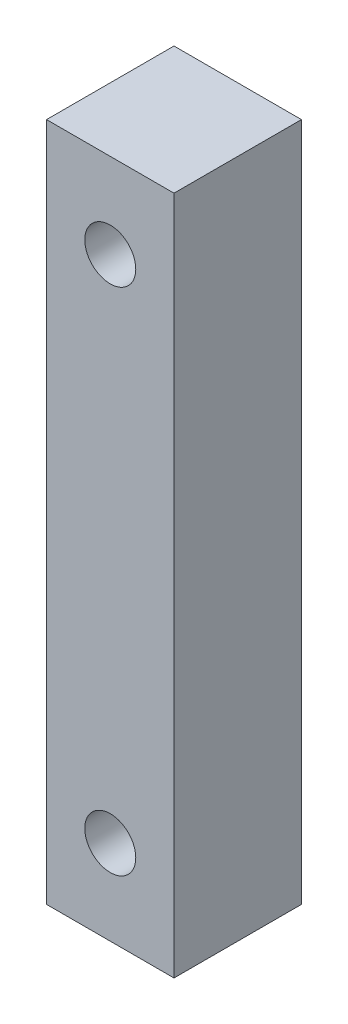
ISO-10303-21;
HEADER;
FILE_DESCRIPTION(('STEP AP214'),'2;1');
FILE_NAME('part.step','',(''),(''),'','','');
FILE_SCHEMA(('AUTOMOTIVE_DESIGN { 1 0 10303 214 1 1 1 1 }'));
ENDSEC;
DATA;
#1=APPLICATION_CONTEXT('core data for automotive mechanical design processes');
#2=APPLICATION_PROTOCOL_DEFINITION('international standard','automotive_design',2000,#1);
#3=PRODUCT_CONTEXT('',#1,'mechanical');
#4=PRODUCT('Part','Part','',(#3));
#5=PRODUCT_RELATED_PRODUCT_CATEGORY('part','',(#4));
#6=PRODUCT_DEFINITION_FORMATION('','',#4);
#7=PRODUCT_DEFINITION_CONTEXT('part definition',#1,'design');
#8=PRODUCT_DEFINITION('design','',#6,#7);
#9=PRODUCT_DEFINITION_SHAPE('','',#8);
#10=(LENGTH_UNIT() NAMED_UNIT(*) SI_UNIT(.MILLI.,.METRE.));
#11=(NAMED_UNIT(*) PLANE_ANGLE_UNIT() SI_UNIT($,.RADIAN.));
#12=(NAMED_UNIT(*) SI_UNIT($,.STERADIAN.) SOLID_ANGLE_UNIT());
#13=UNCERTAINTY_MEASURE_WITH_UNIT(LENGTH_MEASURE(1.E-05),#10,'distance_accuracy_value','');
#14=(GEOMETRIC_REPRESENTATION_CONTEXT(3) GLOBAL_UNCERTAINTY_ASSIGNED_CONTEXT((#13)) GLOBAL_UNIT_ASSIGNED_CONTEXT((#10,
#11,#12)) REPRESENTATION_CONTEXT('',''));
#15=CARTESIAN_POINT('',(0.,0.,0.));
#16=DIRECTION('',(0.,0.,1.));
#17=DIRECTION('',(1.,0.,0.));
#18=AXIS2_PLACEMENT_3D('',#15,#16,#17);
#19=CARTESIAN_POINT('',(0.,80.,0.));
#20=DIRECTION('',(1.,0.,0.));
#21=DIRECTION('',(0.,0.,-1.));
#22=AXIS2_PLACEMENT_3D('',#19,#20,#21);
#23=PLANE('',#22);
#24=DIRECTION('',(0.,0.,1.));
#25=VECTOR('',#24,1.);
#26=CARTESIAN_POINT('',(0.,0.,0.));
#27=LINE('',#26,#25);
#28=CARTESIAN_POINT('',(0.,0.,0.));
#29=VERTEX_POINT('',#28);
#30=CARTESIAN_POINT('',(0.,0.,15.));
#31=VERTEX_POINT('',#30);
#32=EDGE_CURVE('E104',#29,#31,#27,.T.);
#33=ORIENTED_EDGE('',*,*,#32,.T.);
#34=DIRECTION('',(0.,-1.,0.));
#35=VECTOR('',#34,1.);
#36=CARTESIAN_POINT('',(0.,80.,15.));
#37=LINE('',#36,#35);
#38=CARTESIAN_POINT('',(0.,80.,15.));
#39=VERTEX_POINT('',#38);
#40=EDGE_CURVE('E11',#39,#31,#37,.T.);
#41=ORIENTED_EDGE('',*,*,#40,.F.);
#42=DIRECTION('',(0.,0.,1.));
#43=VECTOR('',#42,1.);
#44=CARTESIAN_POINT('',(0.,80.,0.));
#45=LINE('',#44,#43);
#46=CARTESIAN_POINT('',(0.,80.,0.));
#47=VERTEX_POINT('',#46);
#48=EDGE_CURVE('E92',#47,#39,#45,.T.);
#49=ORIENTED_EDGE('',*,*,#48,.F.);
#50=DIRECTION('',(0.,-1.,0.));
#51=VECTOR('',#50,1.);
#52=CARTESIAN_POINT('',(0.,80.,0.));
#53=LINE('',#52,#51);
#54=EDGE_CURVE('E100',#47,#29,#53,.T.);
#55=ORIENTED_EDGE('',*,*,#54,.T.);
#56=EDGE_LOOP('',(#33,#41,#49,#55));
#57=FACE_BOUND('',#56,.T.);
#58=ADVANCED_FACE('F41',(#57),#23,.F.);
#59=CARTESIAN_POINT('',(0.,80.,15.));
#60=DIRECTION('',(0.,0.,-1.));
#61=DIRECTION('',(-1.,0.,0.));
#62=AXIS2_PLACEMENT_3D('',#59,#60,#61);
#63=PLANE('',#62);
#64=CARTESIAN_POINT('',(7.5,70.,15.));
#65=DIRECTION('',(0.,0.,1.));
#66=DIRECTION('',(1.,0.,0.));
#67=AXIS2_PLACEMENT_3D('',#64,#65,#66);
#68=CIRCLE('',#67,3.);
#69=CARTESIAN_POINT('',(10.5,70.,15.));
#70=VERTEX_POINT('',#69);
#71=EDGE_CURVE('E124',#70,#70,#68,.T.);
#72=ORIENTED_EDGE('',*,*,#71,.F.);
#73=EDGE_LOOP('',(#72));
#74=FACE_BOUND('',#73,.T.);
#75=CARTESIAN_POINT('',(7.50000000000001,10.,15.));
#76=DIRECTION('',(0.,0.,1.));
#77=DIRECTION('',(1.,0.,0.));
#78=AXIS2_PLACEMENT_3D('',#75,#76,#77);
#79=CIRCLE('',#78,3.);
#80=CARTESIAN_POINT('',(10.5,10.,15.));
#81=VERTEX_POINT('',#80);
#82=EDGE_CURVE('E121',#81,#81,#79,.T.);
#83=ORIENTED_EDGE('',*,*,#82,.F.);
#84=EDGE_LOOP('',(#83));
#85=FACE_BOUND('',#84,.T.);
#86=DIRECTION('',(1.,0.,0.));
#87=VECTOR('',#86,1.);
#88=CARTESIAN_POINT('',(0.,0.,15.));
#89=LINE('',#88,#87);
#90=CARTESIAN_POINT('',(15.,0.,15.));
#91=VERTEX_POINT('',#90);
#92=EDGE_CURVE('E96',#31,#91,#89,.T.);
#93=ORIENTED_EDGE('',*,*,#92,.T.);
#94=DIRECTION('',(0.,-1.,0.));
#95=VECTOR('',#94,1.);
#96=CARTESIAN_POINT('',(15.,80.,15.));
#97=LINE('',#96,#95);
#98=CARTESIAN_POINT('',(15.,80.,15.));
#99=VERTEX_POINT('',#98);
#100=EDGE_CURVE('E49',#99,#91,#97,.T.);
#101=ORIENTED_EDGE('',*,*,#100,.F.);
#102=DIRECTION('',(1.,0.,0.));
#103=VECTOR('',#102,1.);
#104=CARTESIAN_POINT('',(0.,80.,15.));
#105=LINE('',#104,#103);
#106=EDGE_CURVE('E87',#39,#99,#105,.T.);
#107=ORIENTED_EDGE('',*,*,#106,.F.);
#108=ORIENTED_EDGE('',*,*,#40,.T.);
#109=EDGE_LOOP('',(#93,#101,#107,#108));
#110=FACE_BOUND('',#109,.T.);
#111=ADVANCED_FACE('F95',(#74,#85,#110),#63,.F.);
#112=CARTESIAN_POINT('',(15.,80.,0.));
#113=DIRECTION('',(-1.,0.,0.));
#114=DIRECTION('',(0.,0.,1.));
#115=AXIS2_PLACEMENT_3D('',#112,#113,#114);
#116=PLANE('',#115);
#117=DIRECTION('',(0.,0.,-1.));
#118=VECTOR('',#117,1.);
#119=CARTESIAN_POINT('',(15.,0.,0.));
#120=LINE('',#119,#118);
#121=CARTESIAN_POINT('',(15.,0.,0.));
#122=VERTEX_POINT('',#121);
#123=EDGE_CURVE('E74',#91,#122,#120,.T.);
#124=ORIENTED_EDGE('',*,*,#123,.T.);
#125=DIRECTION('',(0.,-1.,0.));
#126=VECTOR('',#125,1.);
#127=CARTESIAN_POINT('',(15.,80.,0.));
#128=LINE('',#127,#126);
#129=CARTESIAN_POINT('',(15.,80.,0.));
#130=VERTEX_POINT('',#129);
#131=EDGE_CURVE('E97',#130,#122,#128,.T.);
#132=ORIENTED_EDGE('',*,*,#131,.F.);
#133=DIRECTION('',(0.,0.,-1.));
#134=VECTOR('',#133,1.);
#135=CARTESIAN_POINT('',(15.,80.,0.));
#136=LINE('',#135,#134);
#137=EDGE_CURVE('E90',#99,#130,#136,.T.);
#138=ORIENTED_EDGE('',*,*,#137,.F.);
#139=ORIENTED_EDGE('',*,*,#100,.T.);
#140=EDGE_LOOP('',(#124,#132,#138,#139));
#141=FACE_BOUND('',#140,.T.);
#142=ADVANCED_FACE('F98',(#141),#116,.F.);
#143=CARTESIAN_POINT('',(0.,80.,0.));
#144=DIRECTION('',(0.,0.,1.));
#145=DIRECTION('',(1.,0.,0.));
#146=AXIS2_PLACEMENT_3D('',#143,#144,#145);
#147=PLANE('',#146);
#148=CARTESIAN_POINT('',(7.5,70.,0.));
#149=DIRECTION('',(0.,0.,1.));
#150=DIRECTION('',(1.,0.,0.));
#151=AXIS2_PLACEMENT_3D('',#148,#149,#150);
#152=CIRCLE('',#151,3.);
#153=CARTESIAN_POINT('',(10.5,70.,0.));
#154=VERTEX_POINT('',#153);
#155=EDGE_CURVE('E107',#154,#154,#152,.T.);
#156=ORIENTED_EDGE('',*,*,#155,.T.);
#157=EDGE_LOOP('',(#156));
#158=FACE_BOUND('',#157,.T.);
#159=CARTESIAN_POINT('',(7.50000000000001,10.,0.));
#160=DIRECTION('',(0.,0.,1.));
#161=DIRECTION('',(1.,0.,0.));
#162=AXIS2_PLACEMENT_3D('',#159,#160,#161);
#163=CIRCLE('',#162,3.);
#164=CARTESIAN_POINT('',(10.5,10.,0.));
#165=VERTEX_POINT('',#164);
#166=EDGE_CURVE('E118',#165,#165,#163,.T.);
#167=ORIENTED_EDGE('',*,*,#166,.T.);
#168=EDGE_LOOP('',(#167));
#169=FACE_BOUND('',#168,.T.);
#170=DIRECTION('',(-1.,0.,0.));
#171=VECTOR('',#170,1.);
#172=CARTESIAN_POINT('',(0.,0.,0.));
#173=LINE('',#172,#171);
#174=EDGE_CURVE('E80',#122,#29,#173,.T.);
#175=ORIENTED_EDGE('',*,*,#174,.T.);
#176=ORIENTED_EDGE('',*,*,#54,.F.);
#177=DIRECTION('',(-1.,0.,0.));
#178=VECTOR('',#177,1.);
#179=CARTESIAN_POINT('',(0.,80.,0.));
#180=LINE('',#179,#178);
#181=EDGE_CURVE('E57',#130,#47,#180,.T.);
#182=ORIENTED_EDGE('',*,*,#181,.F.);
#183=ORIENTED_EDGE('',*,*,#131,.T.);
#184=EDGE_LOOP('',(#175,#176,#182,#183));
#185=FACE_BOUND('',#184,.T.);
#186=ADVANCED_FACE('F112',(#158,#169,#185),#147,.F.);
#187=CARTESIAN_POINT('',(0.,80.,0.));
#188=DIRECTION('',(0.,1.,0.));
#189=DIRECTION('',(0.,0.,1.));
#190=AXIS2_PLACEMENT_3D('',#187,#188,#189);
#191=PLANE('',#190);
#192=ORIENTED_EDGE('',*,*,#48,.T.);
#193=ORIENTED_EDGE('',*,*,#106,.T.);
#194=ORIENTED_EDGE('',*,*,#137,.T.);
#195=ORIENTED_EDGE('',*,*,#181,.T.);
#196=EDGE_LOOP('',(#192,#193,#194,#195));
#197=FACE_BOUND('',#196,.T.);
#198=ADVANCED_FACE('F88',(#197),#191,.T.);
#199=CARTESIAN_POINT('',(0.,0.,0.));
#200=DIRECTION('',(0.,1.,0.));
#201=DIRECTION('',(0.,0.,1.));
#202=AXIS2_PLACEMENT_3D('',#199,#200,#201);
#203=PLANE('',#202);
#204=ORIENTED_EDGE('',*,*,#32,.F.);
#205=ORIENTED_EDGE('',*,*,#174,.F.);
#206=ORIENTED_EDGE('',*,*,#123,.F.);
#207=ORIENTED_EDGE('',*,*,#92,.F.);
#208=EDGE_LOOP('',(#204,#205,#206,#207));
#209=FACE_BOUND('',#208,.T.);
#210=ADVANCED_FACE('F115',(#209),#203,.F.);
#211=CARTESIAN_POINT('',(7.50000000000001,10.,0.));
#212=DIRECTION('',(0.,0.,1.));
#213=DIRECTION('',(1.,0.,0.));
#214=AXIS2_PLACEMENT_3D('',#211,#212,#213);
#215=CYLINDRICAL_SURFACE('',#214,3.);
#216=ORIENTED_EDGE('',*,*,#166,.F.);
#217=EDGE_LOOP('',(#216));
#218=FACE_BOUND('',#217,.T.);
#219=ORIENTED_EDGE('',*,*,#82,.T.);
#220=EDGE_LOOP('',(#219));
#221=FACE_BOUND('',#220,.T.);
#222=ADVANCED_FACE('F135',(#218,#221),#215,.F.);
#223=CARTESIAN_POINT('',(7.5,70.,0.));
#224=DIRECTION('',(0.,0.,1.));
#225=DIRECTION('',(1.,0.,0.));
#226=AXIS2_PLACEMENT_3D('',#223,#224,#225);
#227=CYLINDRICAL_SURFACE('',#226,3.);
#228=ORIENTED_EDGE('',*,*,#155,.F.);
#229=EDGE_LOOP('',(#228));
#230=FACE_BOUND('',#229,.T.);
#231=ORIENTED_EDGE('',*,*,#71,.T.);
#232=EDGE_LOOP('',(#231));
#233=FACE_BOUND('',#232,.T.);
#234=ADVANCED_FACE('F132',(#230,#233),#227,.F.);
#235=CLOSED_SHELL('',(#58,#111,#142,#186,#198,#210,#222,#234));
#236=MANIFOLD_SOLID_BREP('B2',#235);
#237=ADVANCED_BREP_SHAPE_REPRESENTATION('',(#18,#236),#14);
#238=SHAPE_DEFINITION_REPRESENTATION(#9,#237);
ENDSEC;
END-ISO-10303-21;
